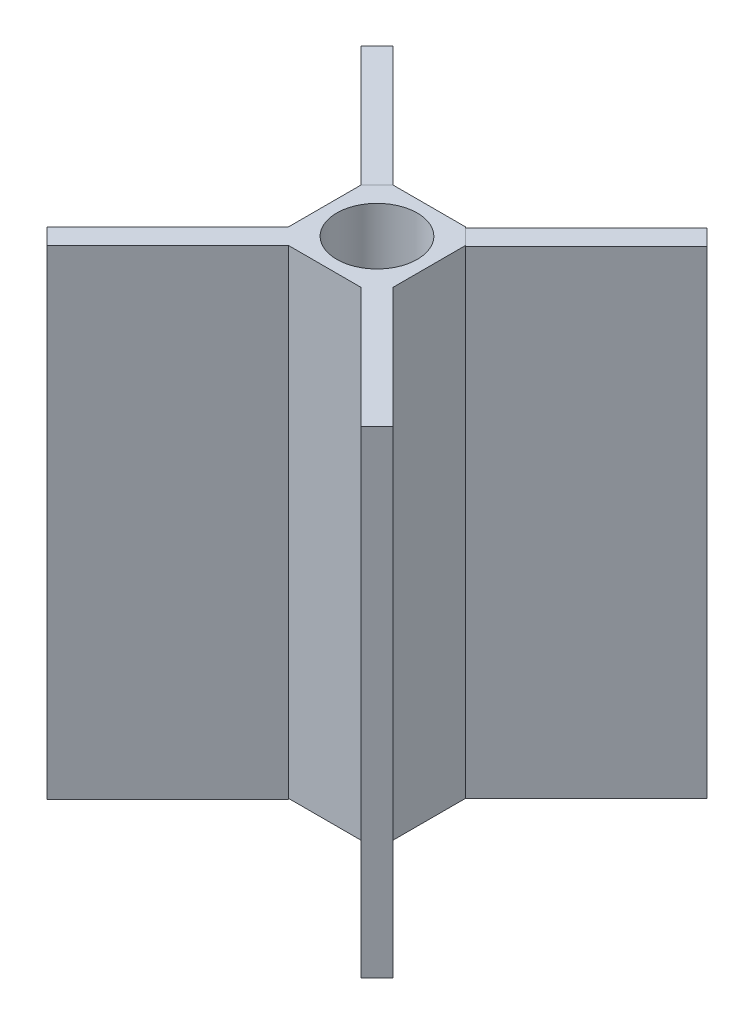
ISO-10303-21;
HEADER;
FILE_DESCRIPTION(('STEP AP214'),'2;1');
FILE_NAME('part.step','',(''),(''),'','','');
FILE_SCHEMA(('AUTOMOTIVE_DESIGN { 1 0 10303 214 1 1 1 1 }'));
ENDSEC;
DATA;
#1=APPLICATION_CONTEXT('core data for automotive mechanical design processes');
#2=APPLICATION_PROTOCOL_DEFINITION('international standard','automotive_design',2000,#1);
#3=PRODUCT_CONTEXT('',#1,'mechanical');
#4=PRODUCT('Part','Part','',(#3));
#5=PRODUCT_RELATED_PRODUCT_CATEGORY('part','',(#4));
#6=PRODUCT_DEFINITION_FORMATION('','',#4);
#7=PRODUCT_DEFINITION_CONTEXT('part definition',#1,'design');
#8=PRODUCT_DEFINITION('design','',#6,#7);
#9=PRODUCT_DEFINITION_SHAPE('','',#8);
#10=(LENGTH_UNIT() NAMED_UNIT(*) SI_UNIT(.MILLI.,.METRE.));
#11=(NAMED_UNIT(*) PLANE_ANGLE_UNIT() SI_UNIT($,.RADIAN.));
#12=(NAMED_UNIT(*) SI_UNIT($,.STERADIAN.) SOLID_ANGLE_UNIT());
#13=UNCERTAINTY_MEASURE_WITH_UNIT(LENGTH_MEASURE(1.E-05),#10,'distance_accuracy_value','');
#14=(GEOMETRIC_REPRESENTATION_CONTEXT(3) GLOBAL_UNCERTAINTY_ASSIGNED_CONTEXT((#13)) GLOBAL_UNIT_ASSIGNED_CONTEXT((#10,
#11,#12)) REPRESENTATION_CONTEXT('',''));
#15=CARTESIAN_POINT('',(0.,0.,0.));
#16=DIRECTION('',(0.,0.,1.));
#17=DIRECTION('',(1.,0.,0.));
#18=AXIS2_PLACEMENT_3D('',#15,#16,#17);
#19=CARTESIAN_POINT('',(6.5,59.5,4.5));
#20=DIRECTION('',(-0.707106781186546,0.,-0.707106781186549));
#21=DIRECTION('',(0.,-1.,0.));
#22=AXIS2_PLACEMENT_3D('',#19,#20,#21);
#23=PLANE('',#22);
#24=DIRECTION('',(0.,-1.,0.));
#25=VECTOR('',#24,1.);
#26=CARTESIAN_POINT('',(6.5,59.5,4.5));
#27=LINE('',#26,#25);
#28=CARTESIAN_POINT('',(6.5,0.174230490472382,4.5));
#29=VERTEX_POINT('',#28);
#30=CARTESIAN_POINT('',(6.5,0.,4.5));
#31=VERTEX_POINT('',#30);
#32=EDGE_CURVE('E324',#29,#31,#27,.T.);
#33=ORIENTED_EDGE('',*,*,#32,.F.);
#34=DIRECTION('',(0.707106781186549,0.,-0.707106781186546));
#35=VECTOR('',#34,1.);
#36=CARTESIAN_POINT('',(6.5,0.174230490472382,4.5));
#37=LINE('',#36,#35);
#38=CARTESIAN_POINT('',(4.49999999999999,0.174230490472382,6.5));
#39=VERTEX_POINT('',#38);
#40=EDGE_CURVE('E195',#39,#29,#37,.T.);
#41=ORIENTED_EDGE('',*,*,#40,.F.);
#42=DIRECTION('',(0.,1.,0.));
#43=VECTOR('',#42,1.);
#44=CARTESIAN_POINT('',(4.49999999999999,59.5,6.5));
#45=LINE('',#44,#43);
#46=CARTESIAN_POINT('',(4.49999999999999,0.,6.5));
#47=VERTEX_POINT('',#46);
#48=EDGE_CURVE('E291',#47,#39,#45,.T.);
#49=ORIENTED_EDGE('',*,*,#48,.F.);
#50=DIRECTION('',(0.707106781186549,0.,-0.707106781186546));
#51=VECTOR('',#50,1.);
#52=CARTESIAN_POINT('',(5.49999999999999,0.,5.50000000000001));
#53=LINE('',#52,#51);
#54=EDGE_CURVE('E306',#31,#47,#53,.F.);
#55=ORIENTED_EDGE('',*,*,#54,.F.);
#56=EDGE_LOOP('',(#33,#41,#49,#55));
#57=FACE_BOUND('',#56,.T.);
#58=ADVANCED_FACE('F35',(#57),#23,.F.);
#59=CARTESIAN_POINT('',(-6.5,59.5,-4.5));
#60=DIRECTION('',(0.707106781186546,0.,0.707106781186549));
#61=DIRECTION('',(0.,-1.,0.));
#62=AXIS2_PLACEMENT_3D('',#59,#60,#61);
#63=PLANE('',#62);
#64=DIRECTION('',(0.,1.,0.));
#65=VECTOR('',#64,1.);
#66=CARTESIAN_POINT('',(-4.49999999999999,59.5,-6.5));
#67=LINE('',#66,#65);
#68=CARTESIAN_POINT('',(-4.49999999999999,59.4605230528771,-6.5));
#69=VERTEX_POINT('',#68);
#70=CARTESIAN_POINT('',(-4.49999999999999,59.5,-6.5));
#71=VERTEX_POINT('',#70);
#72=EDGE_CURVE('E326',#69,#71,#67,.T.);
#73=ORIENTED_EDGE('',*,*,#72,.F.);
#74=DIRECTION('',(0.707106781186549,0.,-0.707106781186546));
#75=VECTOR('',#74,1.);
#76=CARTESIAN_POINT('',(-4.49999999999999,59.4605230528771,-6.5));
#77=LINE('',#76,#75);
#78=CARTESIAN_POINT('',(-6.5,59.4605230528771,-4.5));
#79=VERTEX_POINT('',#78);
#80=EDGE_CURVE('E237',#79,#69,#77,.T.);
#81=ORIENTED_EDGE('',*,*,#80,.F.);
#82=DIRECTION('',(0.,-1.,0.));
#83=VECTOR('',#82,1.);
#84=CARTESIAN_POINT('',(-6.5,59.5,-4.5));
#85=LINE('',#84,#83);
#86=CARTESIAN_POINT('',(-6.5,59.5,-4.49999999999999));
#87=VERTEX_POINT('',#86);
#88=EDGE_CURVE('E311',#87,#79,#85,.T.);
#89=ORIENTED_EDGE('',*,*,#88,.F.);
#90=DIRECTION('',(0.707106781186549,0.,-0.707106781186546));
#91=VECTOR('',#90,1.);
#92=CARTESIAN_POINT('',(-6.5,59.5,-4.5));
#93=LINE('',#92,#91);
#94=EDGE_CURVE('E317',#71,#87,#93,.F.);
#95=ORIENTED_EDGE('',*,*,#94,.F.);
#96=EDGE_LOOP('',(#73,#81,#89,#95));
#97=FACE_BOUND('',#96,.T.);
#98=ADVANCED_FACE('F37',(#97),#63,.F.);
#99=CARTESIAN_POINT('',(6.5,59.5,6.5));
#100=DIRECTION('',(-1.,0.,0.));
#101=DIRECTION('',(0.,0.,1.));
#102=AXIS2_PLACEMENT_3D('',#99,#100,#101);
#103=PLANE('',#102);
#104=DIRECTION('',(0.,0.,-1.));
#105=VECTOR('',#104,1.);
#106=CARTESIAN_POINT('',(6.5,59.5,6.5));
#107=LINE('',#106,#105);
#108=CARTESIAN_POINT('',(6.5,59.5,4.5));
#109=VERTEX_POINT('',#108);
#110=CARTESIAN_POINT('',(6.5,59.5,-4.49999999999999));
#111=VERTEX_POINT('',#110);
#112=EDGE_CURVE('E281',#109,#111,#107,.T.);
#113=ORIENTED_EDGE('',*,*,#112,.F.);
#114=EDGE_CURVE('E199',#109,#29,#27,.T.);
#115=ORIENTED_EDGE('',*,*,#114,.T.);
#116=ORIENTED_EDGE('',*,*,#32,.T.);
#117=DIRECTION('',(0.,0.,-1.));
#118=VECTOR('',#117,1.);
#119=CARTESIAN_POINT('',(6.5,0.,6.5));
#120=LINE('',#119,#118);
#121=CARTESIAN_POINT('',(6.5,0.,-4.49999999999999));
#122=VERTEX_POINT('',#121);
#123=EDGE_CURVE('E280',#31,#122,#120,.T.);
#124=ORIENTED_EDGE('',*,*,#123,.T.);
#125=DIRECTION('',(0.,1.,0.));
#126=VECTOR('',#125,1.);
#127=CARTESIAN_POINT('',(6.5,59.5,-4.49999999999999));
#128=LINE('',#127,#126);
#129=CARTESIAN_POINT('',(6.5,59.3706347989382,-4.49999999999999));
#130=VERTEX_POINT('',#129);
#131=EDGE_CURVE('E322',#122,#130,#128,.T.);
#132=ORIENTED_EDGE('',*,*,#131,.T.);
#133=EDGE_CURVE('E321',#130,#111,#128,.T.);
#134=ORIENTED_EDGE('',*,*,#133,.T.);
#135=EDGE_LOOP('',(#113,#115,#116,#124,#132,#134));
#136=FACE_BOUND('',#135,.T.);
#137=ADVANCED_FACE('F400',(#136),#103,.F.);
#138=CARTESIAN_POINT('',(-6.5,59.5,-6.5));
#139=DIRECTION('',(0.,0.,1.));
#140=DIRECTION('',(1.,0.,0.));
#141=AXIS2_PLACEMENT_3D('',#138,#139,#140);
#142=PLANE('',#141);
#143=DIRECTION('',(-1.,0.,0.));
#144=VECTOR('',#143,1.);
#145=CARTESIAN_POINT('',(-6.5,59.5,-6.5));
#146=LINE('',#145,#144);
#147=CARTESIAN_POINT('',(4.49999999999999,59.5,-6.5));
#148=VERTEX_POINT('',#147);
#149=EDGE_CURVE('E283',#148,#71,#146,.T.);
#150=ORIENTED_EDGE('',*,*,#149,.F.);
#151=DIRECTION('',(0.,-1.,0.));
#152=VECTOR('',#151,1.);
#153=CARTESIAN_POINT('',(4.5,59.5,-6.5));
#154=LINE('',#153,#152);
#155=CARTESIAN_POINT('',(4.5,59.3706347989382,-6.5));
#156=VERTEX_POINT('',#155);
#157=EDGE_CURVE('E11',#148,#156,#154,.T.);
#158=ORIENTED_EDGE('',*,*,#157,.T.);
#159=DIRECTION('',(0.,1.,0.));
#160=VECTOR('',#159,1.);
#161=CARTESIAN_POINT('',(4.5,0.,-6.5));
#162=LINE('',#161,#160);
#163=CARTESIAN_POINT('',(4.49999999999999,0.,-6.5));
#164=VERTEX_POINT('',#163);
#165=EDGE_CURVE('E253',#164,#156,#162,.T.);
#166=ORIENTED_EDGE('',*,*,#165,.F.);
#167=DIRECTION('',(-1.,0.,0.));
#168=VECTOR('',#167,1.);
#169=CARTESIAN_POINT('',(-6.5,0.,-6.5));
#170=LINE('',#169,#168);
#171=CARTESIAN_POINT('',(-4.49999999999999,0.,-6.5));
#172=VERTEX_POINT('',#171);
#173=EDGE_CURVE('E293',#164,#172,#170,.T.);
#174=ORIENTED_EDGE('',*,*,#173,.T.);
#175=EDGE_CURVE('E44',#172,#69,#67,.T.);
#176=ORIENTED_EDGE('',*,*,#175,.T.);
#177=ORIENTED_EDGE('',*,*,#72,.T.);
#178=EDGE_LOOP('',(#150,#158,#166,#174,#176,#177));
#179=FACE_BOUND('',#178,.T.);
#180=ADVANCED_FACE('F332',(#179),#142,.F.);
#181=CARTESIAN_POINT('',(-6.5,59.5,6.5));
#182=DIRECTION('',(1.,0.,0.));
#183=DIRECTION('',(0.,0.,-1.));
#184=AXIS2_PLACEMENT_3D('',#181,#182,#183);
#185=PLANE('',#184);
#186=DIRECTION('',(0.,0.,1.));
#187=VECTOR('',#186,1.);
#188=CARTESIAN_POINT('',(-6.5,0.,6.5));
#189=LINE('',#188,#187);
#190=CARTESIAN_POINT('',(-6.5,0.,-4.5));
#191=VERTEX_POINT('',#190);
#192=CARTESIAN_POINT('',(-6.5,0.,4.49999999999999));
#193=VERTEX_POINT('',#192);
#194=EDGE_CURVE('E296',#191,#193,#189,.T.);
#195=ORIENTED_EDGE('',*,*,#194,.T.);
#196=DIRECTION('',(0.,1.,0.));
#197=VECTOR('',#196,1.);
#198=CARTESIAN_POINT('',(-6.5,59.5,4.49999999999999));
#199=LINE('',#198,#197);
#200=CARTESIAN_POINT('',(-6.5,59.5,4.49999999999999));
#201=VERTEX_POINT('',#200);
#202=EDGE_CURVE('E314',#193,#201,#199,.T.);
#203=ORIENTED_EDGE('',*,*,#202,.T.);
#204=DIRECTION('',(0.,0.,1.));
#205=VECTOR('',#204,1.);
#206=CARTESIAN_POINT('',(-6.5,59.5,6.5));
#207=LINE('',#206,#205);
#208=EDGE_CURVE('E287',#87,#201,#207,.T.);
#209=ORIENTED_EDGE('',*,*,#208,.F.);
#210=ORIENTED_EDGE('',*,*,#88,.T.);
#211=DIRECTION('',(0.,1.,0.));
#212=VECTOR('',#211,1.);
#213=CARTESIAN_POINT('',(-6.5,0.,-4.5));
#214=LINE('',#213,#212);
#215=EDGE_CURVE('E232',#191,#79,#214,.T.);
#216=ORIENTED_EDGE('',*,*,#215,.F.);
#217=EDGE_LOOP('',(#195,#203,#209,#210,#216));
#218=FACE_BOUND('',#217,.T.);
#219=ADVANCED_FACE('F342',(#218),#185,.F.);
#220=CARTESIAN_POINT('',(-6.5,59.5,6.5));
#221=DIRECTION('',(0.,0.,-1.));
#222=DIRECTION('',(-1.,0.,0.));
#223=AXIS2_PLACEMENT_3D('',#220,#221,#222);
#224=PLANE('',#223);
#225=DIRECTION('',(1.,0.,0.));
#226=VECTOR('',#225,1.);
#227=CARTESIAN_POINT('',(-6.5,59.5,6.5));
#228=LINE('',#227,#226);
#229=CARTESIAN_POINT('',(-4.5,59.5,6.5));
#230=VERTEX_POINT('',#229);
#231=CARTESIAN_POINT('',(4.49999999999999,59.5,6.5));
#232=VERTEX_POINT('',#231);
#233=EDGE_CURVE('E289',#230,#232,#228,.T.);
#234=ORIENTED_EDGE('',*,*,#233,.F.);
#235=DIRECTION('',(0.,-1.,0.));
#236=VECTOR('',#235,1.);
#237=CARTESIAN_POINT('',(-4.5,59.5,6.5));
#238=LINE('',#237,#236);
#239=CARTESIAN_POINT('',(-4.5,0.,6.5));
#240=VERTEX_POINT('',#239);
#241=EDGE_CURVE('E303',#230,#240,#238,.T.);
#242=ORIENTED_EDGE('',*,*,#241,.T.);
#243=DIRECTION('',(1.,0.,0.));
#244=VECTOR('',#243,1.);
#245=CARTESIAN_POINT('',(-6.5,0.,6.5));
#246=LINE('',#245,#244);
#247=EDGE_CURVE('E284',#240,#47,#246,.T.);
#248=ORIENTED_EDGE('',*,*,#247,.T.);
#249=ORIENTED_EDGE('',*,*,#48,.T.);
#250=DIRECTION('',(0.,-1.,0.));
#251=VECTOR('',#250,1.);
#252=CARTESIAN_POINT('',(4.49999999999999,59.5,6.5));
#253=LINE('',#252,#251);
#254=EDGE_CURVE('E363',#232,#39,#253,.T.);
#255=ORIENTED_EDGE('',*,*,#254,.F.);
#256=EDGE_LOOP('',(#234,#242,#248,#249,#255));
#257=FACE_BOUND('',#256,.T.);
#258=ADVANCED_FACE('F361',(#257),#224,.F.);
#259=CARTESIAN_POINT('',(0.,59.5,0.));
#260=DIRECTION('',(0.,-1.,0.));
#261=DIRECTION('',(0.,0.,-1.));
#262=AXIS2_PLACEMENT_3D('',#259,#260,#261);
#263=PLANE('',#262);
#264=CARTESIAN_POINT('',(0.,59.5,0.));
#265=DIRECTION('',(0.,1.,0.));
#266=DIRECTION('',(0.,0.,1.));
#267=AXIS2_PLACEMENT_3D('',#264,#265,#266);
#268=CIRCLE('',#267,5.);
#269=CARTESIAN_POINT('',(0.,59.5,5.));
#270=VERTEX_POINT('',#269);
#271=EDGE_CURVE('E370',#270,#270,#268,.T.);
#272=ORIENTED_EDGE('',*,*,#271,.F.);
#273=EDGE_LOOP('',(#272));
#274=FACE_BOUND('',#273,.T.);
#275=ORIENTED_EDGE('',*,*,#208,.T.);
#276=DIRECTION('',(0.707106781186549,0.,-0.707106781186546));
#277=VECTOR('',#276,1.);
#278=CARTESIAN_POINT('',(-21.5048058967786,59.5,19.5048058967785));
#279=LINE('',#278,#277);
#280=CARTESIAN_POINT('',(-21.5048058967786,59.5,19.5048058967785));
#281=VERTEX_POINT('',#280);
#282=EDGE_CURVE('E227',#281,#201,#279,.T.);
#283=ORIENTED_EDGE('',*,*,#282,.F.);
#284=DIRECTION('',(-0.707106781186546,0.,-0.707106781186549));
#285=VECTOR('',#284,1.);
#286=CARTESIAN_POINT('',(-19.5048058967786,59.5,21.5048058967785));
#287=LINE('',#286,#285);
#288=CARTESIAN_POINT('',(-19.5048058967786,59.5,21.5048058967785));
#289=VERTEX_POINT('',#288);
#290=EDGE_CURVE('E212',#289,#281,#287,.T.);
#291=ORIENTED_EDGE('',*,*,#290,.F.);
#292=DIRECTION('',(0.707106781186549,0.,-0.707106781186546));
#293=VECTOR('',#292,1.);
#294=CARTESIAN_POINT('',(-19.5048058967786,59.5,21.5048058967785));
#295=LINE('',#294,#293);
#296=EDGE_CURVE('E229',#289,#230,#295,.T.);
#297=ORIENTED_EDGE('',*,*,#296,.T.);
#298=ORIENTED_EDGE('',*,*,#233,.T.);
#299=DIRECTION('',(-0.707106781186546,0.,-0.707106781186549));
#300=VECTOR('',#299,1.);
#301=CARTESIAN_POINT('',(19.5048058967785,59.5,21.5048058967786));
#302=LINE('',#301,#300);
#303=CARTESIAN_POINT('',(19.5048058967785,59.5,21.5048058967786));
#304=VERTEX_POINT('',#303);
#305=EDGE_CURVE('E183',#304,#232,#302,.T.);
#306=ORIENTED_EDGE('',*,*,#305,.F.);
#307=DIRECTION('',(-0.707106781186549,0.,0.707106781186546));
#308=VECTOR('',#307,1.);
#309=CARTESIAN_POINT('',(21.5048058967785,59.5,19.5048058967786));
#310=LINE('',#309,#308);
#311=CARTESIAN_POINT('',(21.5048058967785,59.5,19.5048058967786));
#312=VERTEX_POINT('',#311);
#313=EDGE_CURVE('E174',#312,#304,#310,.T.);
#314=ORIENTED_EDGE('',*,*,#313,.F.);
#315=DIRECTION('',(-0.707106781186546,0.,-0.707106781186549));
#316=VECTOR('',#315,1.);
#317=CARTESIAN_POINT('',(21.5048058967785,59.5,19.5048058967786));
#318=LINE('',#317,#316);
#319=EDGE_CURVE('E180',#312,#109,#318,.T.);
#320=ORIENTED_EDGE('',*,*,#319,.T.);
#321=ORIENTED_EDGE('',*,*,#112,.T.);
#322=DIRECTION('',(0.707106781186546,0.,0.707106781186549));
#323=VECTOR('',#322,1.);
#324=CARTESIAN_POINT('',(4.5,59.5,-6.5));
#325=LINE('',#324,#323);
#326=EDGE_CURVE('E319',#111,#148,#325,.F.);
#327=ORIENTED_EDGE('',*,*,#326,.T.);
#328=ORIENTED_EDGE('',*,*,#149,.T.);
#329=ORIENTED_EDGE('',*,*,#94,.T.);
#330=EDGE_LOOP('',(#275,#283,#291,#297,#298,#306,#314,#320,#321,#327,#328,#329));
#331=FACE_BOUND('',#330,.T.);
#332=ADVANCED_FACE('F177',(#274,#331),#263,.F.);
#333=CARTESIAN_POINT('',(0.,0.,0.));
#334=DIRECTION('',(0.,-1.,0.));
#335=DIRECTION('',(0.,0.,-1.));
#336=AXIS2_PLACEMENT_3D('',#333,#334,#335);
#337=PLANE('',#336);
#338=CARTESIAN_POINT('',(0.,0.,0.));
#339=DIRECTION('',(0.,-1.,0.));
#340=DIRECTION('',(0.,0.,-1.));
#341=AXIS2_PLACEMENT_3D('',#338,#339,#340);
#342=CIRCLE('',#341,5.);
#343=CARTESIAN_POINT('',(0.,0.,-5.));
#344=VERTEX_POINT('',#343);
#345=EDGE_CURVE('E39',#344,#344,#342,.T.);
#346=ORIENTED_EDGE('',*,*,#345,.F.);
#347=EDGE_LOOP('',(#346));
#348=FACE_BOUND('',#347,.T.);
#349=ORIENTED_EDGE('',*,*,#247,.F.);
#350=DIRECTION('',(0.707106781186546,0.,0.707106781186549));
#351=VECTOR('',#350,1.);
#352=CARTESIAN_POINT('',(-5.50000000000001,0.,5.49999999999999));
#353=LINE('',#352,#351);
#354=EDGE_CURVE('E308',#240,#193,#353,.F.);
#355=ORIENTED_EDGE('',*,*,#354,.T.);
#356=ORIENTED_EDGE('',*,*,#194,.F.);
#357=DIRECTION('',(0.707106781186546,0.,0.707106781186549));
#358=VECTOR('',#357,1.);
#359=CARTESIAN_POINT('',(-21.5048058967785,0.,-19.5048058967786));
#360=LINE('',#359,#358);
#361=CARTESIAN_POINT('',(-21.5048058967785,0.,-19.5048058967786));
#362=VERTEX_POINT('',#361);
#363=EDGE_CURVE('E249',#362,#191,#360,.T.);
#364=ORIENTED_EDGE('',*,*,#363,.F.);
#365=DIRECTION('',(-0.707106781186549,0.,0.707106781186546));
#366=VECTOR('',#365,1.);
#367=CARTESIAN_POINT('',(-19.5048058967785,0.,-21.5048058967786));
#368=LINE('',#367,#366);
#369=CARTESIAN_POINT('',(-19.5048058967785,0.,-21.5048058967786));
#370=VERTEX_POINT('',#369);
#371=EDGE_CURVE('E236',#370,#362,#368,.T.);
#372=ORIENTED_EDGE('',*,*,#371,.F.);
#373=DIRECTION('',(0.707106781186546,0.,0.707106781186549));
#374=VECTOR('',#373,1.);
#375=CARTESIAN_POINT('',(-19.5048058967785,0.,-21.5048058967786));
#376=LINE('',#375,#374);
#377=EDGE_CURVE('E251',#370,#172,#376,.T.);
#378=ORIENTED_EDGE('',*,*,#377,.T.);
#379=ORIENTED_EDGE('',*,*,#173,.F.);
#380=DIRECTION('',(-0.707106781186549,0.,0.707106781186546));
#381=VECTOR('',#380,1.);
#382=CARTESIAN_POINT('',(19.5048058967786,0.,-21.5048058967785));
#383=LINE('',#382,#381);
#384=CARTESIAN_POINT('',(19.5048058967786,0.,-21.5048058967785));
#385=VERTEX_POINT('',#384);
#386=EDGE_CURVE('E274',#385,#164,#383,.T.);
#387=ORIENTED_EDGE('',*,*,#386,.F.);
#388=DIRECTION('',(-0.707106781186547,0.,-0.707106781186548));
#389=VECTOR('',#388,1.);
#390=CARTESIAN_POINT('',(21.5048058967786,0.,-19.5048058967785));
#391=LINE('',#390,#389);
#392=CARTESIAN_POINT('',(21.5048058967786,0.,-19.5048058967785));
#393=VERTEX_POINT('',#392);
#394=EDGE_CURVE('E257',#393,#385,#391,.T.);
#395=ORIENTED_EDGE('',*,*,#394,.F.);
#396=DIRECTION('',(-0.707106781186549,0.,0.707106781186546));
#397=VECTOR('',#396,1.);
#398=CARTESIAN_POINT('',(21.5048058967786,0.,-19.5048058967785));
#399=LINE('',#398,#397);
#400=EDGE_CURVE('E277',#393,#122,#399,.T.);
#401=ORIENTED_EDGE('',*,*,#400,.T.);
#402=ORIENTED_EDGE('',*,*,#123,.F.);
#403=ORIENTED_EDGE('',*,*,#54,.T.);
#404=EDGE_LOOP('',(#349,#355,#356,#364,#372,#378,#379,#387,#395,#401,#402,#403));
#405=FACE_BOUND('',#404,.T.);
#406=ADVANCED_FACE('F383',(#348,#405),#337,.T.);
#407=CARTESIAN_POINT('',(4.5,59.5,-6.5));
#408=DIRECTION('',(-0.707106781186549,0.,0.707106781186546));
#409=DIRECTION('',(0.,-1.,0.));
#410=AXIS2_PLACEMENT_3D('',#407,#408,#409);
#411=PLANE('',#410);
#412=DIRECTION('',(0.707106781186547,0.,0.707106781186548));
#413=VECTOR('',#412,1.);
#414=CARTESIAN_POINT('',(6.5,59.3706347989382,-4.49999999999999));
#415=LINE('',#414,#413);
#416=EDGE_CURVE('E258',#156,#130,#415,.T.);
#417=ORIENTED_EDGE('',*,*,#416,.F.);
#418=ORIENTED_EDGE('',*,*,#157,.F.);
#419=ORIENTED_EDGE('',*,*,#326,.F.);
#420=ORIENTED_EDGE('',*,*,#133,.F.);
#421=EDGE_LOOP('',(#417,#418,#419,#420));
#422=FACE_BOUND('',#421,.T.);
#423=ADVANCED_FACE('F389',(#422),#411,.F.);
#424=CARTESIAN_POINT('',(21.5048058967786,0.,-19.5048058967785));
#425=DIRECTION('',(-0.707106781186546,0.,-0.707106781186549));
#426=DIRECTION('',(-0.707106781186549,0.,0.707106781186546));
#427=AXIS2_PLACEMENT_3D('',#424,#425,#426);
#428=PLANE('',#427);
#429=ORIENTED_EDGE('',*,*,#131,.F.);
#430=ORIENTED_EDGE('',*,*,#400,.F.);
#431=DIRECTION('',(0.,-1.,0.));
#432=VECTOR('',#431,1.);
#433=CARTESIAN_POINT('',(21.5048058967786,0.,-19.5048058967785));
#434=LINE('',#433,#432);
#435=CARTESIAN_POINT('',(21.5048058967786,59.3706347989382,-19.5048058967785));
#436=VERTEX_POINT('',#435);
#437=EDGE_CURVE('E254',#436,#393,#434,.T.);
#438=ORIENTED_EDGE('',*,*,#437,.F.);
#439=DIRECTION('',(-0.707106781186549,0.,0.707106781186546));
#440=VECTOR('',#439,1.);
#441=CARTESIAN_POINT('',(21.5048058967786,59.3706347989382,-19.5048058967785));
#442=LINE('',#441,#440);
#443=EDGE_CURVE('E264',#436,#130,#442,.T.);
#444=ORIENTED_EDGE('',*,*,#443,.T.);
#445=EDGE_LOOP('',(#429,#430,#438,#444));
#446=FACE_BOUND('',#445,.T.);
#447=ADVANCED_FACE('F404',(#446),#428,.F.);
#448=CARTESIAN_POINT('',(19.5048058967786,0.,-21.5048058967785));
#449=DIRECTION('',(0.707106781186546,0.,0.707106781186549));
#450=DIRECTION('',(0.707106781186549,0.,-0.707106781186546));
#451=AXIS2_PLACEMENT_3D('',#448,#449,#450);
#452=PLANE('',#451);
#453=ORIENTED_EDGE('',*,*,#165,.T.);
#454=DIRECTION('',(-0.707106781186549,0.,0.707106781186546));
#455=VECTOR('',#454,1.);
#456=CARTESIAN_POINT('',(19.5048058967786,59.3706347989382,-21.5048058967785));
#457=LINE('',#456,#455);
#458=CARTESIAN_POINT('',(19.5048058967786,59.3706347989382,-21.5048058967785));
#459=VERTEX_POINT('',#458);
#460=EDGE_CURVE('E271',#459,#156,#457,.T.);
#461=ORIENTED_EDGE('',*,*,#460,.F.);
#462=DIRECTION('',(0.,1.,0.));
#463=VECTOR('',#462,1.);
#464=CARTESIAN_POINT('',(19.5048058967786,0.,-21.5048058967785));
#465=LINE('',#464,#463);
#466=EDGE_CURVE('E260',#385,#459,#465,.T.);
#467=ORIENTED_EDGE('',*,*,#466,.F.);
#468=ORIENTED_EDGE('',*,*,#386,.T.);
#469=EDGE_LOOP('',(#453,#461,#467,#468));
#470=FACE_BOUND('',#469,.T.);
#471=ADVANCED_FACE('F409',(#470),#452,.F.);
#472=CARTESIAN_POINT('',(21.5048058967786,59.3706347989382,-19.5048058967785));
#473=DIRECTION('',(0.,-1.,0.));
#474=DIRECTION('',(0.,0.,-1.));
#475=AXIS2_PLACEMENT_3D('',#472,#473,#474);
#476=PLANE('',#475);
#477=ORIENTED_EDGE('',*,*,#416,.T.);
#478=ORIENTED_EDGE('',*,*,#443,.F.);
#479=DIRECTION('',(0.707106781186547,0.,0.707106781186548));
#480=VECTOR('',#479,1.);
#481=CARTESIAN_POINT('',(21.5048058967786,59.3706347989382,-19.5048058967785));
#482=LINE('',#481,#480);
#483=EDGE_CURVE('E262',#459,#436,#482,.T.);
#484=ORIENTED_EDGE('',*,*,#483,.F.);
#485=ORIENTED_EDGE('',*,*,#460,.T.);
#486=EDGE_LOOP('',(#477,#478,#484,#485));
#487=FACE_BOUND('',#486,.T.);
#488=ADVANCED_FACE('F420',(#487),#476,.F.);
#489=CARTESIAN_POINT('',(20.5048058967786,0.,-20.5048058967785));
#490=DIRECTION('',(-0.707106781186548,0.,0.707106781186547));
#491=DIRECTION('',(0.707106781186547,0.,0.707106781186548));
#492=AXIS2_PLACEMENT_3D('',#489,#490,#491);
#493=PLANE('',#492);
#494=ORIENTED_EDGE('',*,*,#437,.T.);
#495=ORIENTED_EDGE('',*,*,#394,.T.);
#496=ORIENTED_EDGE('',*,*,#466,.T.);
#497=ORIENTED_EDGE('',*,*,#483,.T.);
#498=EDGE_LOOP('',(#494,#495,#496,#497));
#499=FACE_BOUND('',#498,.T.);
#500=ADVANCED_FACE('F423',(#499),#493,.F.);
#501=CARTESIAN_POINT('',(-19.5048058967785,0.,-21.5048058967786));
#502=DIRECTION('',(-0.707106781186549,0.,0.707106781186546));
#503=DIRECTION('',(0.707106781186546,0.,0.707106781186549));
#504=AXIS2_PLACEMENT_3D('',#501,#502,#503);
#505=PLANE('',#504);
#506=ORIENTED_EDGE('',*,*,#175,.F.);
#507=ORIENTED_EDGE('',*,*,#377,.F.);
#508=DIRECTION('',(0.,-1.,0.));
#509=VECTOR('',#508,1.);
#510=CARTESIAN_POINT('',(-19.5048058967785,0.,-21.5048058967786));
#511=LINE('',#510,#509);
#512=CARTESIAN_POINT('',(-19.5048058967785,59.4605230528771,-21.5048058967786));
#513=VERTEX_POINT('',#512);
#514=EDGE_CURVE('E233',#513,#370,#511,.T.);
#515=ORIENTED_EDGE('',*,*,#514,.F.);
#516=DIRECTION('',(0.707106781186546,0.,0.707106781186549));
#517=VECTOR('',#516,1.);
#518=CARTESIAN_POINT('',(-19.5048058967785,59.4605230528771,-21.5048058967786));
#519=LINE('',#518,#517);
#520=EDGE_CURVE('E243',#513,#69,#519,.T.);
#521=ORIENTED_EDGE('',*,*,#520,.T.);
#522=EDGE_LOOP('',(#506,#507,#515,#521));
#523=FACE_BOUND('',#522,.T.);
#524=ADVANCED_FACE('F430',(#523),#505,.F.);
#525=CARTESIAN_POINT('',(-21.5048058967785,0.,-19.5048058967786));
#526=DIRECTION('',(0.707106781186549,0.,-0.707106781186546));
#527=DIRECTION('',(-0.707106781186546,0.,-0.707106781186549));
#528=AXIS2_PLACEMENT_3D('',#525,#526,#527);
#529=PLANE('',#528);
#530=ORIENTED_EDGE('',*,*,#215,.T.);
#531=DIRECTION('',(0.707106781186546,0.,0.707106781186549));
#532=VECTOR('',#531,1.);
#533=CARTESIAN_POINT('',(-21.5048058967785,59.4605230528771,-19.5048058967786));
#534=LINE('',#533,#532);
#535=CARTESIAN_POINT('',(-21.5048058967785,59.4605230528771,-19.5048058967786));
#536=VERTEX_POINT('',#535);
#537=EDGE_CURVE('E59',#536,#79,#534,.T.);
#538=ORIENTED_EDGE('',*,*,#537,.F.);
#539=DIRECTION('',(0.,1.,0.));
#540=VECTOR('',#539,1.);
#541=CARTESIAN_POINT('',(-21.5048058967785,0.,-19.5048058967786));
#542=LINE('',#541,#540);
#543=EDGE_CURVE('E239',#362,#536,#542,.T.);
#544=ORIENTED_EDGE('',*,*,#543,.F.);
#545=ORIENTED_EDGE('',*,*,#363,.T.);
#546=EDGE_LOOP('',(#530,#538,#544,#545));
#547=FACE_BOUND('',#546,.T.);
#548=ADVANCED_FACE('F437',(#547),#529,.F.);
#549=CARTESIAN_POINT('',(-19.5048058967785,59.4605230528771,-21.5048058967786));
#550=DIRECTION('',(0.,-1.,0.));
#551=DIRECTION('',(0.,0.,-1.));
#552=AXIS2_PLACEMENT_3D('',#549,#550,#551);
#553=PLANE('',#552);
#554=ORIENTED_EDGE('',*,*,#80,.T.);
#555=ORIENTED_EDGE('',*,*,#520,.F.);
#556=DIRECTION('',(0.707106781186549,0.,-0.707106781186546));
#557=VECTOR('',#556,1.);
#558=CARTESIAN_POINT('',(-19.5048058967785,59.4605230528771,-21.5048058967786));
#559=LINE('',#558,#557);
#560=EDGE_CURVE('E241',#536,#513,#559,.T.);
#561=ORIENTED_EDGE('',*,*,#560,.F.);
#562=ORIENTED_EDGE('',*,*,#537,.T.);
#563=EDGE_LOOP('',(#554,#555,#561,#562));
#564=FACE_BOUND('',#563,.T.);
#565=ADVANCED_FACE('F432',(#564),#553,.F.);
#566=CARTESIAN_POINT('',(-20.5048058967785,0.,-20.5048058967786));
#567=DIRECTION('',(0.707106781186546,0.,0.707106781186549));
#568=DIRECTION('',(0.707106781186549,0.,-0.707106781186546));
#569=AXIS2_PLACEMENT_3D('',#566,#567,#568);
#570=PLANE('',#569);
#571=ORIENTED_EDGE('',*,*,#514,.T.);
#572=ORIENTED_EDGE('',*,*,#371,.T.);
#573=ORIENTED_EDGE('',*,*,#543,.T.);
#574=ORIENTED_EDGE('',*,*,#560,.T.);
#575=EDGE_LOOP('',(#571,#572,#573,#574));
#576=FACE_BOUND('',#575,.T.);
#577=ADVANCED_FACE('F434',(#576),#570,.F.);
#578=CARTESIAN_POINT('',(-19.5048058967786,59.5,21.5048058967785));
#579=DIRECTION('',(-0.707106781186546,0.,-0.707106781186549));
#580=DIRECTION('',(-0.707106781186549,0.,0.707106781186546));
#581=AXIS2_PLACEMENT_3D('',#578,#579,#580);
#582=PLANE('',#581);
#583=DIRECTION('',(0.,1.,0.));
#584=VECTOR('',#583,1.);
#585=CARTESIAN_POINT('',(-4.5,59.5,6.5));
#586=LINE('',#585,#584);
#587=CARTESIAN_POINT('',(-4.5,-0.114279406872669,6.5));
#588=VERTEX_POINT('',#587);
#589=EDGE_CURVE('E201',#588,#240,#586,.T.);
#590=ORIENTED_EDGE('',*,*,#589,.T.);
#591=ORIENTED_EDGE('',*,*,#241,.F.);
#592=ORIENTED_EDGE('',*,*,#296,.F.);
#593=DIRECTION('',(0.,1.,0.));
#594=VECTOR('',#593,1.);
#595=CARTESIAN_POINT('',(-19.5048058967786,59.5,21.5048058967785));
#596=LINE('',#595,#594);
#597=CARTESIAN_POINT('',(-19.5048058967786,-0.114279406872669,21.5048058967785));
#598=VERTEX_POINT('',#597);
#599=EDGE_CURVE('E209',#598,#289,#596,.T.);
#600=ORIENTED_EDGE('',*,*,#599,.F.);
#601=DIRECTION('',(0.707106781186549,0.,-0.707106781186546));
#602=VECTOR('',#601,1.);
#603=CARTESIAN_POINT('',(-19.5048058967786,-0.114279406872669,21.5048058967785));
#604=LINE('',#603,#602);
#605=EDGE_CURVE('E218',#598,#588,#604,.T.);
#606=ORIENTED_EDGE('',*,*,#605,.T.);
#607=EDGE_LOOP('',(#590,#591,#592,#600,#606));
#608=FACE_BOUND('',#607,.T.);
#609=ADVANCED_FACE('F357',(#608),#582,.F.);
#610=CARTESIAN_POINT('',(-21.5048058967786,59.5,19.5048058967785));
#611=DIRECTION('',(0.707106781186546,0.,0.707106781186549));
#612=DIRECTION('',(0.707106781186549,0.,-0.707106781186546));
#613=AXIS2_PLACEMENT_3D('',#610,#611,#612);
#614=PLANE('',#613);
#615=ORIENTED_EDGE('',*,*,#202,.F.);
#616=DIRECTION('',(0.,-1.,0.));
#617=VECTOR('',#616,1.);
#618=CARTESIAN_POINT('',(-6.5,59.5,4.49999999999999));
#619=LINE('',#618,#617);
#620=CARTESIAN_POINT('',(-6.5,-0.114279406872669,4.49999999999999));
#621=VERTEX_POINT('',#620);
#622=EDGE_CURVE('E204',#193,#621,#619,.T.);
#623=ORIENTED_EDGE('',*,*,#622,.T.);
#624=DIRECTION('',(0.707106781186549,0.,-0.707106781186546));
#625=VECTOR('',#624,1.);
#626=CARTESIAN_POINT('',(-21.5048058967786,-0.114279406872669,19.5048058967785));
#627=LINE('',#626,#625);
#628=CARTESIAN_POINT('',(-21.5048058967786,-0.114279406872669,19.5048058967785));
#629=VERTEX_POINT('',#628);
#630=EDGE_CURVE('E224',#629,#621,#627,.T.);
#631=ORIENTED_EDGE('',*,*,#630,.F.);
#632=DIRECTION('',(0.,-1.,0.));
#633=VECTOR('',#632,1.);
#634=CARTESIAN_POINT('',(-21.5048058967786,59.5,19.5048058967785));
#635=LINE('',#634,#633);
#636=EDGE_CURVE('E215',#281,#629,#635,.T.);
#637=ORIENTED_EDGE('',*,*,#636,.F.);
#638=ORIENTED_EDGE('',*,*,#282,.T.);
#639=EDGE_LOOP('',(#615,#623,#631,#637,#638));
#640=FACE_BOUND('',#639,.T.);
#641=ADVANCED_FACE('F349',(#640),#614,.F.);
#642=CARTESIAN_POINT('',(-19.5048058967786,-0.114279406872669,21.5048058967785));
#643=DIRECTION('',(0.,1.,0.));
#644=DIRECTION('',(0.,0.,1.));
#645=AXIS2_PLACEMENT_3D('',#642,#643,#644);
#646=PLANE('',#645);
#647=DIRECTION('',(0.707106781186546,0.,0.707106781186549));
#648=VECTOR('',#647,1.);
#649=CARTESIAN_POINT('',(-4.5,-0.114279406872669,6.5));
#650=LINE('',#649,#648);
#651=EDGE_CURVE('E213',#621,#588,#650,.T.);
#652=ORIENTED_EDGE('',*,*,#651,.T.);
#653=ORIENTED_EDGE('',*,*,#605,.F.);
#654=DIRECTION('',(0.707106781186546,0.,0.707106781186549));
#655=VECTOR('',#654,1.);
#656=CARTESIAN_POINT('',(-19.5048058967786,-0.114279406872669,21.5048058967785));
#657=LINE('',#656,#655);
#658=EDGE_CURVE('E217',#629,#598,#657,.T.);
#659=ORIENTED_EDGE('',*,*,#658,.F.);
#660=ORIENTED_EDGE('',*,*,#630,.T.);
#661=EDGE_LOOP('',(#652,#653,#659,#660));
#662=FACE_BOUND('',#661,.T.);
#663=ADVANCED_FACE('F443',(#662),#646,.F.);
#664=CARTESIAN_POINT('',(-20.5048058967786,0.,20.5048058967785));
#665=DIRECTION('',(0.707106781186549,0.,-0.707106781186546));
#666=DIRECTION('',(-0.707106781186546,0.,-0.707106781186549));
#667=AXIS2_PLACEMENT_3D('',#664,#665,#666);
#668=PLANE('',#667);
#669=ORIENTED_EDGE('',*,*,#599,.T.);
#670=ORIENTED_EDGE('',*,*,#290,.T.);
#671=ORIENTED_EDGE('',*,*,#636,.T.);
#672=ORIENTED_EDGE('',*,*,#658,.T.);
#673=EDGE_LOOP('',(#669,#670,#671,#672));
#674=FACE_BOUND('',#673,.T.);
#675=ADVANCED_FACE('F352',(#674),#668,.F.);
#676=CARTESIAN_POINT('',(-5.50000000000001,0.,5.49999999999999));
#677=DIRECTION('',(0.707106781186549,0.,-0.707106781186546));
#678=DIRECTION('',(-0.707106781186546,0.,-0.707106781186549));
#679=AXIS2_PLACEMENT_3D('',#676,#677,#678);
#680=PLANE('',#679);
#681=ORIENTED_EDGE('',*,*,#622,.F.);
#682=ORIENTED_EDGE('',*,*,#354,.F.);
#683=ORIENTED_EDGE('',*,*,#589,.F.);
#684=ORIENTED_EDGE('',*,*,#651,.F.);
#685=EDGE_LOOP('',(#681,#682,#683,#684));
#686=FACE_BOUND('',#685,.T.);
#687=ADVANCED_FACE('F440',(#686),#680,.T.);
#688=CARTESIAN_POINT('',(21.5048058967785,59.5,19.5048058967786));
#689=DIRECTION('',(-0.707106781186549,0.,0.707106781186546));
#690=DIRECTION('',(0.707106781186546,0.,0.707106781186549));
#691=AXIS2_PLACEMENT_3D('',#688,#689,#690);
#692=PLANE('',#691);
#693=ORIENTED_EDGE('',*,*,#114,.F.);
#694=ORIENTED_EDGE('',*,*,#319,.F.);
#695=DIRECTION('',(0.,1.,0.));
#696=VECTOR('',#695,1.);
#697=CARTESIAN_POINT('',(21.5048058967785,59.5,19.5048058967786));
#698=LINE('',#697,#696);
#699=CARTESIAN_POINT('',(21.5048058967785,0.174230490472382,19.5048058967786));
#700=VERTEX_POINT('',#699);
#701=EDGE_CURVE('E187',#700,#312,#698,.T.);
#702=ORIENTED_EDGE('',*,*,#701,.F.);
#703=DIRECTION('',(-0.707106781186546,0.,-0.707106781186549));
#704=VECTOR('',#703,1.);
#705=CARTESIAN_POINT('',(21.5048058967785,0.174230490472382,19.5048058967786));
#706=LINE('',#705,#704);
#707=EDGE_CURVE('E374',#700,#29,#706,.T.);
#708=ORIENTED_EDGE('',*,*,#707,.T.);
#709=EDGE_LOOP('',(#693,#694,#702,#708));
#710=FACE_BOUND('',#709,.T.);
#711=ADVANCED_FACE('F197',(#710),#692,.F.);
#712=CARTESIAN_POINT('',(19.5048058967785,59.5,21.5048058967786));
#713=DIRECTION('',(0.707106781186549,0.,-0.707106781186546));
#714=DIRECTION('',(-0.707106781186546,0.,-0.707106781186549));
#715=AXIS2_PLACEMENT_3D('',#712,#713,#714);
#716=PLANE('',#715);
#717=ORIENTED_EDGE('',*,*,#254,.T.);
#718=DIRECTION('',(-0.707106781186546,0.,-0.707106781186549));
#719=VECTOR('',#718,1.);
#720=CARTESIAN_POINT('',(19.5048058967785,0.174230490472382,21.5048058967786));
#721=LINE('',#720,#719);
#722=CARTESIAN_POINT('',(19.5048058967785,0.174230490472382,21.5048058967786));
#723=VERTEX_POINT('',#722);
#724=EDGE_CURVE('E51',#723,#39,#721,.T.);
#725=ORIENTED_EDGE('',*,*,#724,.F.);
#726=DIRECTION('',(0.,-1.,0.));
#727=VECTOR('',#726,1.);
#728=CARTESIAN_POINT('',(19.5048058967785,59.5,21.5048058967786));
#729=LINE('',#728,#727);
#730=EDGE_CURVE('E186',#304,#723,#729,.T.);
#731=ORIENTED_EDGE('',*,*,#730,.F.);
#732=ORIENTED_EDGE('',*,*,#305,.T.);
#733=EDGE_LOOP('',(#717,#725,#731,#732));
#734=FACE_BOUND('',#733,.T.);
#735=ADVANCED_FACE('F558',(#734),#716,.F.);
#736=CARTESIAN_POINT('',(21.5048058967785,0.174230490472382,19.5048058967786));
#737=DIRECTION('',(0.,1.,0.));
#738=DIRECTION('',(0.,0.,1.));
#739=AXIS2_PLACEMENT_3D('',#736,#737,#738);
#740=PLANE('',#739);
#741=ORIENTED_EDGE('',*,*,#40,.T.);
#742=ORIENTED_EDGE('',*,*,#707,.F.);
#743=DIRECTION('',(0.707106781186549,0.,-0.707106781186546));
#744=VECTOR('',#743,1.);
#745=CARTESIAN_POINT('',(21.5048058967785,0.174230490472382,19.5048058967786));
#746=LINE('',#745,#744);
#747=EDGE_CURVE('E191',#723,#700,#746,.T.);
#748=ORIENTED_EDGE('',*,*,#747,.F.);
#749=ORIENTED_EDGE('',*,*,#724,.T.);
#750=EDGE_LOOP('',(#741,#742,#748,#749));
#751=FACE_BOUND('',#750,.T.);
#752=ADVANCED_FACE('F567',(#751),#740,.F.);
#753=CARTESIAN_POINT('',(20.5048058967785,0.,20.5048058967786));
#754=DIRECTION('',(-0.707106781186546,0.,-0.707106781186549));
#755=DIRECTION('',(-0.707106781186549,0.,0.707106781186546));
#756=AXIS2_PLACEMENT_3D('',#753,#754,#755);
#757=PLANE('',#756);
#758=ORIENTED_EDGE('',*,*,#701,.T.);
#759=ORIENTED_EDGE('',*,*,#313,.T.);
#760=ORIENTED_EDGE('',*,*,#730,.T.);
#761=ORIENTED_EDGE('',*,*,#747,.T.);
#762=EDGE_LOOP('',(#758,#759,#760,#761));
#763=FACE_BOUND('',#762,.T.);
#764=ADVANCED_FACE('F190',(#763),#757,.F.);
#765=CARTESIAN_POINT('',(0.,-0.114279406872669,0.));
#766=DIRECTION('',(0.,1.,0.));
#767=DIRECTION('',(0.,0.,1.));
#768=AXIS2_PLACEMENT_3D('',#765,#766,#767);
#769=CYLINDRICAL_SURFACE('',#768,5.);
#770=ORIENTED_EDGE('',*,*,#345,.T.);
#771=EDGE_LOOP('',(#770));
#772=FACE_BOUND('',#771,.T.);
#773=ORIENTED_EDGE('',*,*,#271,.T.);
#774=EDGE_LOOP('',(#773));
#775=FACE_BOUND('',#774,.T.);
#776=ADVANCED_FACE('F380',(#772,#775),#769,.F.);
#777=CLOSED_SHELL('',(#58,#98,#137,#180,#219,#258,#332,#406,#423,#447,#471,#488,#500,#524,#548,
#565,#577,#609,#641,#663,#675,#687,#711,#735,#752,#764,#776));
#778=MANIFOLD_SOLID_BREP('B2',#777);
#779=ADVANCED_BREP_SHAPE_REPRESENTATION('',(#18,#778),#14);
#780=SHAPE_DEFINITION_REPRESENTATION(#9,#779);
ENDSEC;
END-ISO-10303-21;
